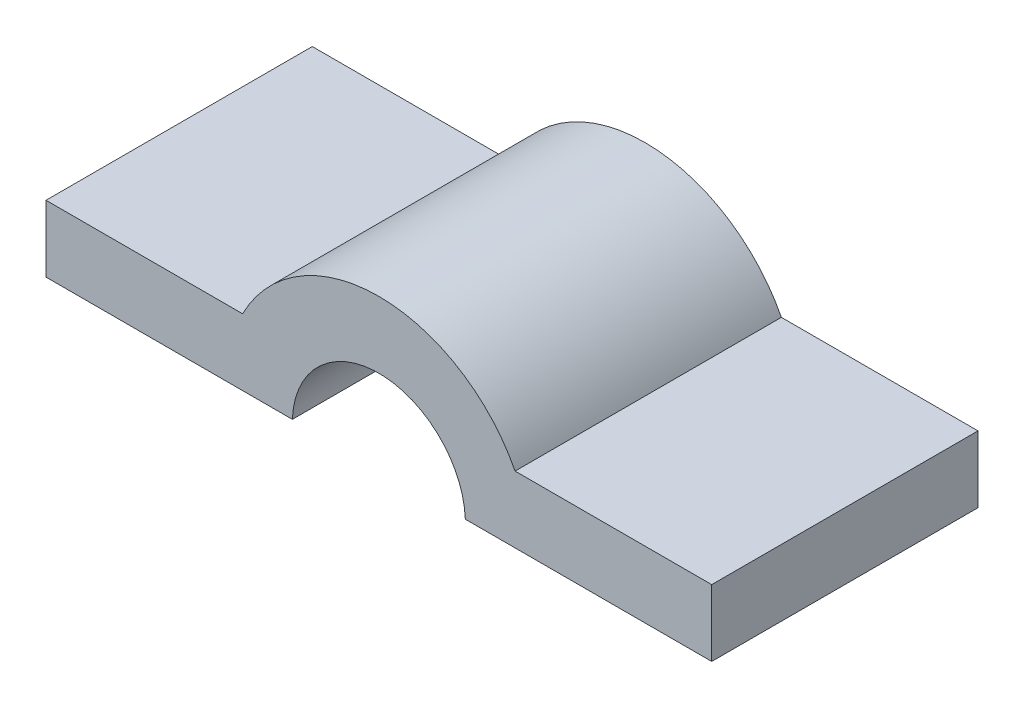
ISO-10303-21;
HEADER;
FILE_DESCRIPTION(('STEP AP214'),'2;1');
FILE_NAME('part.step','',(''),(''),'','','');
FILE_SCHEMA(('AUTOMOTIVE_DESIGN { 1 0 10303 214 1 1 1 1 }'));
ENDSEC;
DATA;
#1=APPLICATION_CONTEXT('core data for automotive mechanical design processes');
#2=APPLICATION_PROTOCOL_DEFINITION('international standard','automotive_design',2000,#1);
#3=PRODUCT_CONTEXT('',#1,'mechanical');
#4=PRODUCT('Part','Part','',(#3));
#5=PRODUCT_RELATED_PRODUCT_CATEGORY('part','',(#4));
#6=PRODUCT_DEFINITION_FORMATION('','',#4);
#7=PRODUCT_DEFINITION_CONTEXT('part definition',#1,'design');
#8=PRODUCT_DEFINITION('design','',#6,#7);
#9=PRODUCT_DEFINITION_SHAPE('','',#8);
#10=(LENGTH_UNIT() NAMED_UNIT(*) SI_UNIT(.MILLI.,.METRE.));
#11=(NAMED_UNIT(*) PLANE_ANGLE_UNIT() SI_UNIT($,.RADIAN.));
#12=(NAMED_UNIT(*) SI_UNIT($,.STERADIAN.) SOLID_ANGLE_UNIT());
#13=UNCERTAINTY_MEASURE_WITH_UNIT(LENGTH_MEASURE(1.E-05),#10,'distance_accuracy_value','');
#14=(GEOMETRIC_REPRESENTATION_CONTEXT(3) GLOBAL_UNCERTAINTY_ASSIGNED_CONTEXT((#13)) GLOBAL_UNIT_ASSIGNED_CONTEXT((#10,
#11,#12)) REPRESENTATION_CONTEXT('',''));
#15=CARTESIAN_POINT('',(0.,0.,0.));
#16=DIRECTION('',(0.,0.,1.));
#17=DIRECTION('',(1.,0.,0.));
#18=AXIS2_PLACEMENT_3D('',#15,#16,#17);
#19=CARTESIAN_POINT('',(0.,0.,-20.));
#20=DIRECTION('',(0.,0.,1.));
#21=DIRECTION('',(1.,0.,0.));
#22=AXIS2_PLACEMENT_3D('',#19,#20,#21);
#23=CYLINDRICAL_SURFACE('',#22,6.5);
#24=CARTESIAN_POINT('',(0.,0.,0.));
#25=DIRECTION('',(0.,0.,-1.));
#26=DIRECTION('',(1.,0.,0.));
#27=AXIS2_PLACEMENT_3D('',#24,#25,#26);
#28=CIRCLE('',#27,6.5);
#29=CARTESIAN_POINT('',(-6.49519052838329,0.25,0.));
#30=VERTEX_POINT('',#29);
#31=CARTESIAN_POINT('',(6.49519052838329,0.25,0.));
#32=VERTEX_POINT('',#31);
#33=EDGE_CURVE('E167',#30,#32,#28,.T.);
#34=ORIENTED_EDGE('',*,*,#33,.F.);
#35=DIRECTION('',(0.,0.,1.));
#36=VECTOR('',#35,1.);
#37=CARTESIAN_POINT('',(-6.49519052838329,0.25,-20.));
#38=LINE('',#37,#36);
#39=CARTESIAN_POINT('',(-6.49519052838329,0.25,-20.));
#40=VERTEX_POINT('',#39);
#41=EDGE_CURVE('E54',#40,#30,#38,.T.);
#42=ORIENTED_EDGE('',*,*,#41,.F.);
#43=CARTESIAN_POINT('',(0.,0.,-20.));
#44=DIRECTION('',(0.,0.,-1.));
#45=DIRECTION('',(1.,0.,0.));
#46=AXIS2_PLACEMENT_3D('',#43,#44,#45);
#47=CIRCLE('',#46,6.5);
#48=CARTESIAN_POINT('',(6.49519052838329,0.25,-20.));
#49=VERTEX_POINT('',#48);
#50=EDGE_CURVE('E130',#40,#49,#47,.T.);
#51=ORIENTED_EDGE('',*,*,#50,.T.);
#52=DIRECTION('',(0.,0.,1.));
#53=VECTOR('',#52,1.);
#54=CARTESIAN_POINT('',(6.49519052838329,0.25,-20.));
#55=LINE('',#54,#53);
#56=EDGE_CURVE('E11',#49,#32,#55,.T.);
#57=ORIENTED_EDGE('',*,*,#56,.T.);
#58=EDGE_LOOP('',(#34,#42,#51,#57));
#59=FACE_BOUND('',#58,.T.);
#60=ADVANCED_FACE('F43',(#59),#23,.F.);
#61=CARTESIAN_POINT('',(-11.4972822875669,0.25,-20.));
#62=DIRECTION('',(0.,-1.,0.));
#63=DIRECTION('',(0.,0.,-1.));
#64=AXIS2_PLACEMENT_3D('',#61,#62,#63);
#65=PLANE('',#64);
#66=DIRECTION('',(1.,0.,0.));
#67=VECTOR('',#66,1.);
#68=CARTESIAN_POINT('',(-11.4972822875669,0.25,0.));
#69=LINE('',#68,#67);
#70=CARTESIAN_POINT('',(-25.,0.25,0.));
#71=VERTEX_POINT('',#70);
#72=EDGE_CURVE('E114',#71,#30,#69,.T.);
#73=ORIENTED_EDGE('',*,*,#72,.F.);
#74=DIRECTION('',(0.,0.,1.));
#75=VECTOR('',#74,1.);
#76=CARTESIAN_POINT('',(-25.,0.25,-20.));
#77=LINE('',#76,#75);
#78=CARTESIAN_POINT('',(-25.,0.25,-20.));
#79=VERTEX_POINT('',#78);
#80=EDGE_CURVE('E110',#79,#71,#77,.T.);
#81=ORIENTED_EDGE('',*,*,#80,.F.);
#82=DIRECTION('',(1.,0.,0.));
#83=VECTOR('',#82,1.);
#84=CARTESIAN_POINT('',(-25.,0.25,-20.));
#85=LINE('',#84,#83);
#86=EDGE_CURVE('E113',#79,#40,#85,.T.);
#87=ORIENTED_EDGE('',*,*,#86,.T.);
#88=ORIENTED_EDGE('',*,*,#41,.T.);
#89=EDGE_LOOP('',(#73,#81,#87,#88));
#90=FACE_BOUND('',#89,.T.);
#91=ADVANCED_FACE('F112',(#90),#65,.T.);
#92=CARTESIAN_POINT('',(-25.,0.25,-20.));
#93=DIRECTION('',(-1.,0.,0.));
#94=DIRECTION('',(0.,0.,1.));
#95=AXIS2_PLACEMENT_3D('',#92,#93,#94);
#96=PLANE('',#95);
#97=DIRECTION('',(0.,-1.,0.));
#98=VECTOR('',#97,1.);
#99=CARTESIAN_POINT('',(-25.,0.25,0.));
#100=LINE('',#99,#98);
#101=CARTESIAN_POINT('',(-25.,5.25,0.));
#102=VERTEX_POINT('',#101);
#103=EDGE_CURVE('E162',#102,#71,#100,.T.);
#104=ORIENTED_EDGE('',*,*,#103,.F.);
#105=DIRECTION('',(0.,0.,1.));
#106=VECTOR('',#105,1.);
#107=CARTESIAN_POINT('',(-25.,5.25,-20.));
#108=LINE('',#107,#106);
#109=CARTESIAN_POINT('',(-25.,5.25,-20.));
#110=VERTEX_POINT('',#109);
#111=EDGE_CURVE('E120',#110,#102,#108,.T.);
#112=ORIENTED_EDGE('',*,*,#111,.F.);
#113=DIRECTION('',(0.,-1.,0.));
#114=VECTOR('',#113,1.);
#115=CARTESIAN_POINT('',(-25.,0.25,-20.));
#116=LINE('',#115,#114);
#117=EDGE_CURVE('E127',#110,#79,#116,.T.);
#118=ORIENTED_EDGE('',*,*,#117,.T.);
#119=ORIENTED_EDGE('',*,*,#80,.T.);
#120=EDGE_LOOP('',(#104,#112,#118,#119));
#121=FACE_BOUND('',#120,.T.);
#122=ADVANCED_FACE('F133',(#121),#96,.T.);
#123=CARTESIAN_POINT('',(-25.,5.25,-20.));
#124=DIRECTION('',(0.,1.,0.));
#125=DIRECTION('',(0.,0.,1.));
#126=AXIS2_PLACEMENT_3D('',#123,#124,#125);
#127=PLANE('',#126);
#128=DIRECTION('',(-1.,0.,0.));
#129=VECTOR('',#128,1.);
#130=CARTESIAN_POINT('',(-25.,5.25,0.));
#131=LINE('',#130,#129);
#132=CARTESIAN_POINT('',(-10.2316909648406,5.25,0.));
#133=VERTEX_POINT('',#132);
#134=EDGE_CURVE('E158',#133,#102,#131,.T.);
#135=ORIENTED_EDGE('',*,*,#134,.F.);
#136=DIRECTION('',(0.,0.,1.));
#137=VECTOR('',#136,1.);
#138=CARTESIAN_POINT('',(-10.2316909648406,5.25,-20.));
#139=LINE('',#138,#137);
#140=CARTESIAN_POINT('',(-10.2316909648406,5.25,-20.));
#141=VERTEX_POINT('',#140);
#142=EDGE_CURVE('E175',#141,#133,#139,.T.);
#143=ORIENTED_EDGE('',*,*,#142,.F.);
#144=DIRECTION('',(-1.,0.,0.));
#145=VECTOR('',#144,1.);
#146=CARTESIAN_POINT('',(-25.,5.25,-20.));
#147=LINE('',#146,#145);
#148=EDGE_CURVE('E135',#141,#110,#147,.T.);
#149=ORIENTED_EDGE('',*,*,#148,.T.);
#150=ORIENTED_EDGE('',*,*,#111,.T.);
#151=EDGE_LOOP('',(#135,#143,#149,#150));
#152=FACE_BOUND('',#151,.T.);
#153=ADVANCED_FACE('F204',(#152),#127,.T.);
#154=CARTESIAN_POINT('',(0.,0.,-20.));
#155=DIRECTION('',(0.,0.,1.));
#156=DIRECTION('',(1.,0.,0.));
#157=AXIS2_PLACEMENT_3D('',#154,#155,#156);
#158=CYLINDRICAL_SURFACE('',#157,11.5);
#159=CARTESIAN_POINT('',(0.,0.,0.));
#160=DIRECTION('',(0.,0.,1.));
#161=DIRECTION('',(1.,0.,0.));
#162=AXIS2_PLACEMENT_3D('',#159,#160,#161);
#163=CIRCLE('',#162,11.5);
#164=CARTESIAN_POINT('',(10.2316909648406,5.25,0.));
#165=VERTEX_POINT('',#164);
#166=EDGE_CURVE('E154',#165,#133,#163,.T.);
#167=ORIENTED_EDGE('',*,*,#166,.F.);
#168=DIRECTION('',(0.,0.,1.));
#169=VECTOR('',#168,1.);
#170=CARTESIAN_POINT('',(10.2316909648406,5.25,-20.));
#171=LINE('',#170,#169);
#172=CARTESIAN_POINT('',(10.2316909648406,5.25,-20.));
#173=VERTEX_POINT('',#172);
#174=EDGE_CURVE('E178',#173,#165,#171,.T.);
#175=ORIENTED_EDGE('',*,*,#174,.F.);
#176=CARTESIAN_POINT('',(0.,0.,-20.));
#177=DIRECTION('',(0.,0.,1.));
#178=DIRECTION('',(1.,0.,0.));
#179=AXIS2_PLACEMENT_3D('',#176,#177,#178);
#180=CIRCLE('',#179,11.5);
#181=EDGE_CURVE('E138',#173,#141,#180,.T.);
#182=ORIENTED_EDGE('',*,*,#181,.T.);
#183=ORIENTED_EDGE('',*,*,#142,.T.);
#184=EDGE_LOOP('',(#167,#175,#182,#183));
#185=FACE_BOUND('',#184,.T.);
#186=ADVANCED_FACE('F207',(#185),#158,.T.);
#187=CARTESIAN_POINT('',(25.,5.25,-20.));
#188=DIRECTION('',(0.,1.,0.));
#189=DIRECTION('',(0.,0.,1.));
#190=AXIS2_PLACEMENT_3D('',#187,#188,#189);
#191=PLANE('',#190);
#192=DIRECTION('',(-1.,0.,0.));
#193=VECTOR('',#192,1.);
#194=CARTESIAN_POINT('',(25.,5.25,0.));
#195=LINE('',#194,#193);
#196=CARTESIAN_POINT('',(25.,5.25,0.));
#197=VERTEX_POINT('',#196);
#198=EDGE_CURVE('E150',#197,#165,#195,.T.);
#199=ORIENTED_EDGE('',*,*,#198,.F.);
#200=DIRECTION('',(0.,0.,1.));
#201=VECTOR('',#200,1.);
#202=CARTESIAN_POINT('',(25.,5.25,-20.));
#203=LINE('',#202,#201);
#204=CARTESIAN_POINT('',(25.,5.25,-20.));
#205=VERTEX_POINT('',#204);
#206=EDGE_CURVE('E180',#205,#197,#203,.T.);
#207=ORIENTED_EDGE('',*,*,#206,.F.);
#208=DIRECTION('',(-1.,0.,0.));
#209=VECTOR('',#208,1.);
#210=CARTESIAN_POINT('',(25.,5.25,-20.));
#211=LINE('',#210,#209);
#212=EDGE_CURVE('E309',#205,#173,#211,.T.);
#213=ORIENTED_EDGE('',*,*,#212,.T.);
#214=ORIENTED_EDGE('',*,*,#174,.T.);
#215=EDGE_LOOP('',(#199,#207,#213,#214));
#216=FACE_BOUND('',#215,.T.);
#217=ADVANCED_FACE('F211',(#216),#191,.T.);
#218=CARTESIAN_POINT('',(25.,0.25,-20.));
#219=DIRECTION('',(1.,0.,0.));
#220=DIRECTION('',(0.,0.,-1.));
#221=AXIS2_PLACEMENT_3D('',#218,#219,#220);
#222=PLANE('',#221);
#223=DIRECTION('',(0.,1.,0.));
#224=VECTOR('',#223,1.);
#225=CARTESIAN_POINT('',(25.,0.25,0.));
#226=LINE('',#225,#224);
#227=CARTESIAN_POINT('',(25.,0.25,0.));
#228=VERTEX_POINT('',#227);
#229=EDGE_CURVE('E146',#228,#197,#226,.T.);
#230=ORIENTED_EDGE('',*,*,#229,.F.);
#231=DIRECTION('',(0.,0.,1.));
#232=VECTOR('',#231,1.);
#233=CARTESIAN_POINT('',(25.,0.25,-20.));
#234=LINE('',#233,#232);
#235=CARTESIAN_POINT('',(25.,0.25,-20.));
#236=VERTEX_POINT('',#235);
#237=EDGE_CURVE('E47',#236,#228,#234,.T.);
#238=ORIENTED_EDGE('',*,*,#237,.F.);
#239=DIRECTION('',(0.,1.,0.));
#240=VECTOR('',#239,1.);
#241=CARTESIAN_POINT('',(25.,0.25,-20.));
#242=LINE('',#241,#240);
#243=EDGE_CURVE('E312',#236,#205,#242,.T.);
#244=ORIENTED_EDGE('',*,*,#243,.T.);
#245=ORIENTED_EDGE('',*,*,#206,.T.);
#246=EDGE_LOOP('',(#230,#238,#244,#245));
#247=FACE_BOUND('',#246,.T.);
#248=ADVANCED_FACE('F188',(#247),#222,.T.);
#249=CARTESIAN_POINT('',(11.4972822875669,0.25,-20.));
#250=DIRECTION('',(0.,-1.,0.));
#251=DIRECTION('',(0.,0.,-1.));
#252=AXIS2_PLACEMENT_3D('',#249,#250,#251);
#253=PLANE('',#252);
#254=DIRECTION('',(1.,0.,0.));
#255=VECTOR('',#254,1.);
#256=CARTESIAN_POINT('',(11.4972822875669,0.25,0.));
#257=LINE('',#256,#255);
#258=EDGE_CURVE('E92',#32,#228,#257,.T.);
#259=ORIENTED_EDGE('',*,*,#258,.F.);
#260=ORIENTED_EDGE('',*,*,#56,.F.);
#261=DIRECTION('',(1.,0.,0.));
#262=VECTOR('',#261,1.);
#263=CARTESIAN_POINT('',(11.4972822875669,0.25,-20.));
#264=LINE('',#263,#262);
#265=EDGE_CURVE('E95',#49,#236,#264,.T.);
#266=ORIENTED_EDGE('',*,*,#265,.T.);
#267=ORIENTED_EDGE('',*,*,#237,.T.);
#268=EDGE_LOOP('',(#259,#260,#266,#267));
#269=FACE_BOUND('',#268,.T.);
#270=ADVANCED_FACE('F45',(#269),#253,.T.);
#271=CARTESIAN_POINT('',(0.,0.,-20.));
#272=DIRECTION('',(0.,0.,1.));
#273=DIRECTION('',(1.,0.,0.));
#274=AXIS2_PLACEMENT_3D('',#271,#272,#273);
#275=PLANE('',#274);
#276=ORIENTED_EDGE('',*,*,#265,.F.);
#277=ORIENTED_EDGE('',*,*,#50,.F.);
#278=ORIENTED_EDGE('',*,*,#86,.F.);
#279=ORIENTED_EDGE('',*,*,#117,.F.);
#280=ORIENTED_EDGE('',*,*,#148,.F.);
#281=ORIENTED_EDGE('',*,*,#181,.F.);
#282=ORIENTED_EDGE('',*,*,#212,.F.);
#283=ORIENTED_EDGE('',*,*,#243,.F.);
#284=EDGE_LOOP('',(#276,#277,#278,#279,#280,#281,#282,#283));
#285=FACE_BOUND('',#284,.T.);
#286=ADVANCED_FACE('F125',(#285),#275,.F.);
#287=CARTESIAN_POINT('',(0.,0.,0.));
#288=DIRECTION('',(0.,0.,1.));
#289=DIRECTION('',(1.,0.,0.));
#290=AXIS2_PLACEMENT_3D('',#287,#288,#289);
#291=PLANE('',#290);
#292=ORIENTED_EDGE('',*,*,#33,.T.);
#293=ORIENTED_EDGE('',*,*,#258,.T.);
#294=ORIENTED_EDGE('',*,*,#229,.T.);
#295=ORIENTED_EDGE('',*,*,#198,.T.);
#296=ORIENTED_EDGE('',*,*,#166,.T.);
#297=ORIENTED_EDGE('',*,*,#134,.T.);
#298=ORIENTED_EDGE('',*,*,#103,.T.);
#299=ORIENTED_EDGE('',*,*,#72,.T.);
#300=EDGE_LOOP('',(#292,#293,#294,#295,#296,#297,#298,#299));
#301=FACE_BOUND('',#300,.T.);
#302=ADVANCED_FACE('F190',(#301),#291,.T.);
#303=CLOSED_SHELL('',(#60,#91,#122,#153,#186,#217,#248,#270,#286,#302));
#304=MANIFOLD_SOLID_BREP('B2',#303);
#305=ADVANCED_BREP_SHAPE_REPRESENTATION('',(#18,#304),#14);
#306=SHAPE_DEFINITION_REPRESENTATION(#9,#305);
ENDSEC;
END-ISO-10303-21;
